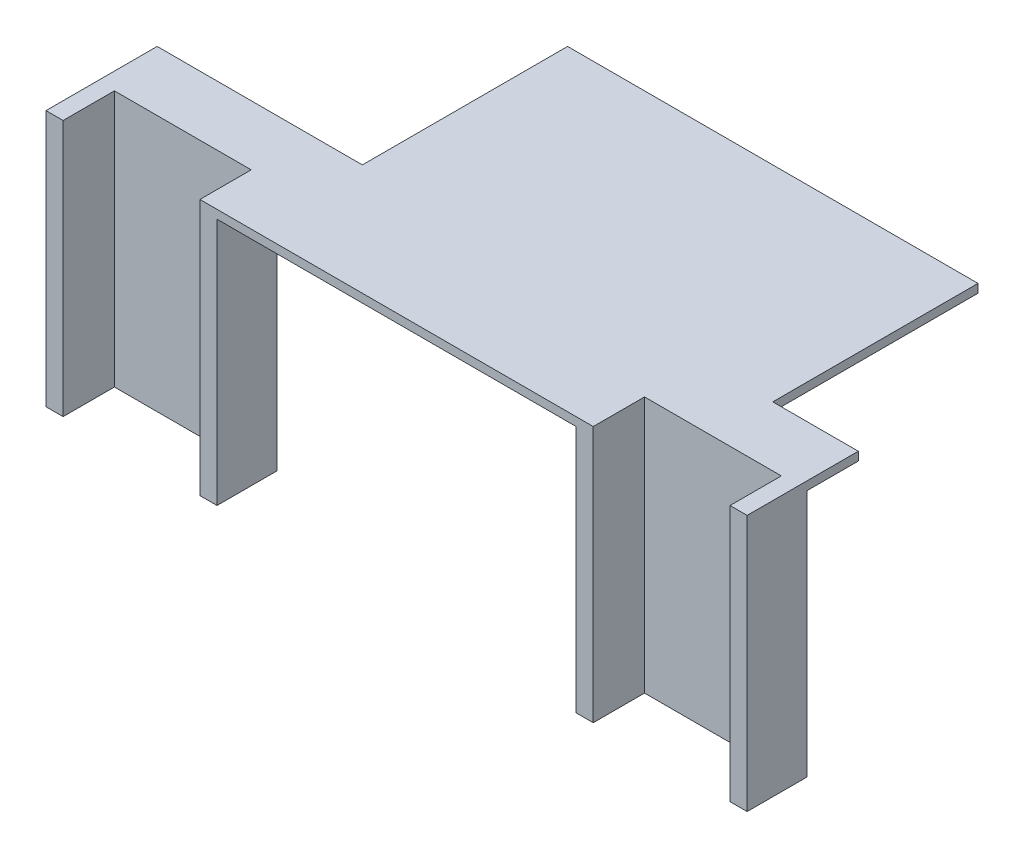
ISO-10303-21;
HEADER;
FILE_DESCRIPTION(('STEP AP214'),'2;1');
FILE_NAME('part.step','',(''),(''),'','','');
FILE_SCHEMA(('AUTOMOTIVE_DESIGN { 1 0 10303 214 1 1 1 1 }'));
ENDSEC;
DATA;
#1=APPLICATION_CONTEXT('core data for automotive mechanical design processes');
#2=APPLICATION_PROTOCOL_DEFINITION('international standard','automotive_design',2000,#1);
#3=PRODUCT_CONTEXT('',#1,'mechanical');
#4=PRODUCT('Part','Part','',(#3));
#5=PRODUCT_RELATED_PRODUCT_CATEGORY('part','',(#4));
#6=PRODUCT_DEFINITION_FORMATION('','',#4);
#7=PRODUCT_DEFINITION_CONTEXT('part definition',#1,'design');
#8=PRODUCT_DEFINITION('design','',#6,#7);
#9=PRODUCT_DEFINITION_SHAPE('','',#8);
#10=(LENGTH_UNIT() NAMED_UNIT(*) SI_UNIT(.MILLI.,.METRE.));
#11=(NAMED_UNIT(*) PLANE_ANGLE_UNIT() SI_UNIT($,.RADIAN.));
#12=(NAMED_UNIT(*) SI_UNIT($,.STERADIAN.) SOLID_ANGLE_UNIT());
#13=UNCERTAINTY_MEASURE_WITH_UNIT(LENGTH_MEASURE(1.E-05),#10,'distance_accuracy_value','');
#14=(GEOMETRIC_REPRESENTATION_CONTEXT(3) GLOBAL_UNCERTAINTY_ASSIGNED_CONTEXT((#13)) GLOBAL_UNIT_ASSIGNED_CONTEXT((#10,
#11,#12)) REPRESENTATION_CONTEXT('',''));
#15=CARTESIAN_POINT('',(0.,0.,0.));
#16=DIRECTION('',(0.,0.,1.));
#17=DIRECTION('',(1.,0.,0.));
#18=AXIS2_PLACEMENT_3D('',#15,#16,#17);
#19=CARTESIAN_POINT('',(0.,0.,35.));
#20=DIRECTION('',(0.,1.,0.));
#21=DIRECTION('',(0.,0.,1.));
#22=AXIS2_PLACEMENT_3D('',#19,#20,#21);
#23=PLANE('',#22);
#24=DIRECTION('',(1.,0.,0.));
#25=VECTOR('',#24,1.);
#26=CARTESIAN_POINT('',(0.,0.,0.));
#27=LINE('',#26,#25);
#28=CARTESIAN_POINT('',(0.,0.,0.));
#29=VERTEX_POINT('',#28);
#30=CARTESIAN_POINT('',(100.,0.,0.));
#31=VERTEX_POINT('',#30);
#32=EDGE_CURVE('E238',#29,#31,#27,.T.);
#33=ORIENTED_EDGE('',*,*,#32,.T.);
#34=DIRECTION('',(0.,0.,1.));
#35=VECTOR('',#34,1.);
#36=CARTESIAN_POINT('',(100.,0.,0.));
#37=LINE('',#36,#35);
#38=CARTESIAN_POINT('',(100.,0.,35.));
#39=VERTEX_POINT('',#38);
#40=EDGE_CURVE('E286',#31,#39,#37,.T.);
#41=ORIENTED_EDGE('',*,*,#40,.T.);
#42=DIRECTION('',(1.,0.,0.));
#43=VECTOR('',#42,1.);
#44=CARTESIAN_POINT('',(0.,0.,35.));
#45=LINE('',#44,#43);
#46=CARTESIAN_POINT('',(90.,0.,35.));
#47=VERTEX_POINT('',#46);
#48=EDGE_CURVE('E227',#47,#39,#45,.T.);
#49=ORIENTED_EDGE('',*,*,#48,.F.);
#50=DIRECTION('',(0.,0.,1.));
#51=VECTOR('',#50,1.);
#52=CARTESIAN_POINT('',(90.,0.,5.));
#53=LINE('',#52,#51);
#54=CARTESIAN_POINT('',(90.,0.,5.));
#55=VERTEX_POINT('',#54);
#56=EDGE_CURVE('E325',#55,#47,#53,.T.);
#57=ORIENTED_EDGE('',*,*,#56,.F.);
#58=DIRECTION('',(1.,0.,0.));
#59=VECTOR('',#58,1.);
#60=CARTESIAN_POINT('',(10.,0.,5.));
#61=LINE('',#60,#59);
#62=CARTESIAN_POINT('',(10.,0.,5.));
#63=VERTEX_POINT('',#62);
#64=EDGE_CURVE('E305',#63,#55,#61,.T.);
#65=ORIENTED_EDGE('',*,*,#64,.F.);
#66=DIRECTION('',(0.,0.,1.));
#67=VECTOR('',#66,1.);
#68=CARTESIAN_POINT('',(10.,0.,5.));
#69=LINE('',#68,#67);
#70=CARTESIAN_POINT('',(10.,0.,35.));
#71=VERTEX_POINT('',#70);
#72=EDGE_CURVE('E315',#63,#71,#69,.T.);
#73=ORIENTED_EDGE('',*,*,#72,.T.);
#74=CARTESIAN_POINT('',(0.,0.,35.));
#75=VERTEX_POINT('',#74);
#76=EDGE_CURVE('E223',#75,#71,#45,.T.);
#77=ORIENTED_EDGE('',*,*,#76,.F.);
#78=DIRECTION('',(0.,0.,-1.));
#79=VECTOR('',#78,1.);
#80=CARTESIAN_POINT('',(0.,0.,35.));
#81=LINE('',#80,#79);
#82=EDGE_CURVE('E250',#75,#29,#81,.T.);
#83=ORIENTED_EDGE('',*,*,#82,.T.);
#84=EDGE_LOOP('',(#33,#41,#49,#57,#65,#73,#77,#83));
#85=FACE_BOUND('',#84,.T.);
#86=ADVANCED_FACE('F38',(#85),#23,.F.);
#87=CARTESIAN_POINT('',(0.,0.,0.));
#88=DIRECTION('',(0.,0.,-1.));
#89=DIRECTION('',(-1.,0.,0.));
#90=AXIS2_PLACEMENT_3D('',#87,#88,#89);
#91=PLANE('',#90);
#92=DIRECTION('',(0.,-1.,0.));
#93=VECTOR('',#92,1.);
#94=CARTESIAN_POINT('',(100.,145.,0.));
#95=LINE('',#94,#93);
#96=CARTESIAN_POINT('',(100.,145.,0.));
#97=VERTEX_POINT('',#96);
#98=EDGE_CURVE('E279',#97,#31,#95,.T.);
#99=ORIENTED_EDGE('',*,*,#98,.T.);
#100=ORIENTED_EDGE('',*,*,#32,.F.);
#101=DIRECTION('',(0.,-1.,0.));
#102=VECTOR('',#101,1.);
#103=CARTESIAN_POINT('',(0.,0.,0.));
#104=LINE('',#103,#102);
#105=CARTESIAN_POINT('',(0.,145.,0.));
#106=VERTEX_POINT('',#105);
#107=EDGE_CURVE('E217',#106,#29,#104,.T.);
#108=ORIENTED_EDGE('',*,*,#107,.F.);
#109=DIRECTION('',(-1.,0.,0.));
#110=VECTOR('',#109,1.);
#111=CARTESIAN_POINT('',(410.,145.,0.));
#112=LINE('',#111,#110);
#113=EDGE_CURVE('E214',#97,#106,#112,.T.);
#114=ORIENTED_EDGE('',*,*,#113,.F.);
#115=EDGE_LOOP('',(#99,#100,#108,#114));
#116=FACE_BOUND('',#115,.T.);
#117=ADVANCED_FACE('F420',(#116),#91,.T.);
#118=CARTESIAN_POINT('',(0.,0.,35.));
#119=DIRECTION('',(0.,0.,-1.));
#120=DIRECTION('',(-1.,0.,0.));
#121=AXIS2_PLACEMENT_3D('',#118,#119,#120);
#122=PLANE('',#121);
#123=ORIENTED_EDGE('',*,*,#76,.T.);
#124=DIRECTION('',(0.,-1.,0.));
#125=VECTOR('',#124,1.);
#126=CARTESIAN_POINT('',(10.,0.,35.));
#127=LINE('',#126,#125);
#128=CARTESIAN_POINT('',(10.,150.,35.));
#129=VERTEX_POINT('',#128);
#130=EDGE_CURVE('E316',#129,#71,#127,.T.);
#131=ORIENTED_EDGE('',*,*,#130,.F.);
#132=DIRECTION('',(-1.,0.,0.));
#133=VECTOR('',#132,1.);
#134=CARTESIAN_POINT('',(0.,150.,35.));
#135=LINE('',#134,#133);
#136=CARTESIAN_POINT('',(0.,150.,35.));
#137=VERTEX_POINT('',#136);
#138=EDGE_CURVE('E230',#129,#137,#135,.T.);
#139=ORIENTED_EDGE('',*,*,#138,.T.);
#140=DIRECTION('',(0.,-1.,0.));
#141=VECTOR('',#140,1.);
#142=CARTESIAN_POINT('',(0.,0.,35.));
#143=LINE('',#142,#141);
#144=EDGE_CURVE('E218',#137,#75,#143,.T.);
#145=ORIENTED_EDGE('',*,*,#144,.T.);
#146=EDGE_LOOP('',(#123,#131,#139,#145));
#147=FACE_BOUND('',#146,.T.);
#148=ADVANCED_FACE('F379',(#147),#122,.F.);
#149=CARTESIAN_POINT('',(410.,150.,35.));
#150=VERTEX_POINT('',#149);
#151=CARTESIAN_POINT('',(400.,150.,35.));
#152=VERTEX_POINT('',#151);
#153=EDGE_CURVE('E231',#150,#152,#135,.T.);
#154=ORIENTED_EDGE('',*,*,#153,.T.);
#155=DIRECTION('',(0.,1.,0.));
#156=VECTOR('',#155,1.);
#157=CARTESIAN_POINT('',(400.,0.,35.));
#158=LINE('',#157,#156);
#159=CARTESIAN_POINT('',(400.,0.,35.));
#160=VERTEX_POINT('',#159);
#161=EDGE_CURVE('E295',#160,#152,#158,.T.);
#162=ORIENTED_EDGE('',*,*,#161,.F.);
#163=CARTESIAN_POINT('',(410.,0.,35.));
#164=VERTEX_POINT('',#163);
#165=EDGE_CURVE('E221',#160,#164,#45,.T.);
#166=ORIENTED_EDGE('',*,*,#165,.T.);
#167=DIRECTION('',(0.,1.,0.));
#168=VECTOR('',#167,1.);
#169=CARTESIAN_POINT('',(410.,0.,35.));
#170=LINE('',#169,#168);
#171=EDGE_CURVE('E226',#164,#150,#170,.T.);
#172=ORIENTED_EDGE('',*,*,#171,.T.);
#173=EDGE_LOOP('',(#154,#162,#166,#172));
#174=FACE_BOUND('',#173,.T.);
#175=ADVANCED_FACE('F358',(#174),#122,.F.);
#176=CARTESIAN_POINT('',(0.,0.,35.));
#177=DIRECTION('',(1.,0.,0.));
#178=DIRECTION('',(0.,0.,-1.));
#179=AXIS2_PLACEMENT_3D('',#176,#177,#178);
#180=PLANE('',#179);
#181=DIRECTION('',(0.,0.,-1.));
#182=VECTOR('',#181,1.);
#183=CARTESIAN_POINT('',(0.,150.,35.));
#184=LINE('',#183,#182);
#185=CARTESIAN_POINT('',(0.,150.,-30.));
#186=VERTEX_POINT('',#185);
#187=EDGE_CURVE('E234',#137,#186,#184,.T.);
#188=ORIENTED_EDGE('',*,*,#187,.T.);
#189=DIRECTION('',(0.,1.,0.));
#190=VECTOR('',#189,1.);
#191=CARTESIAN_POINT('',(0.,140.,-30.));
#192=LINE('',#191,#190);
#193=CARTESIAN_POINT('',(0.,145.,-30.));
#194=VERTEX_POINT('',#193);
#195=EDGE_CURVE('E266',#194,#186,#192,.T.);
#196=ORIENTED_EDGE('',*,*,#195,.F.);
#197=DIRECTION('',(0.,0.,1.));
#198=VECTOR('',#197,1.);
#199=CARTESIAN_POINT('',(0.,145.,-150.));
#200=LINE('',#199,#198);
#201=EDGE_CURVE('E204',#194,#106,#200,.T.);
#202=ORIENTED_EDGE('',*,*,#201,.T.);
#203=ORIENTED_EDGE('',*,*,#107,.T.);
#204=ORIENTED_EDGE('',*,*,#82,.F.);
#205=ORIENTED_EDGE('',*,*,#144,.F.);
#206=EDGE_LOOP('',(#188,#196,#202,#203,#204,#205));
#207=FACE_BOUND('',#206,.T.);
#208=ADVANCED_FACE('F40',(#207),#180,.F.);
#209=CARTESIAN_POINT('',(310.,0.,35.));
#210=VERTEX_POINT('',#209);
#211=CARTESIAN_POINT('',(320.,0.,35.));
#212=VERTEX_POINT('',#211);
#213=EDGE_CURVE('E228',#210,#212,#45,.T.);
#214=ORIENTED_EDGE('',*,*,#213,.F.);
#215=DIRECTION('',(0.,0.,1.));
#216=VECTOR('',#215,1.);
#217=CARTESIAN_POINT('',(310.,0.,0.));
#218=LINE('',#217,#216);
#219=CARTESIAN_POINT('',(310.,0.,0.));
#220=VERTEX_POINT('',#219);
#221=EDGE_CURVE('E298',#220,#210,#218,.T.);
#222=ORIENTED_EDGE('',*,*,#221,.F.);
#223=CARTESIAN_POINT('',(410.,0.,0.));
#224=VERTEX_POINT('',#223);
#225=EDGE_CURVE('E237',#220,#224,#27,.T.);
#226=ORIENTED_EDGE('',*,*,#225,.T.);
#227=DIRECTION('',(0.,0.,-1.));
#228=VECTOR('',#227,1.);
#229=CARTESIAN_POINT('',(410.,0.,35.));
#230=LINE('',#229,#228);
#231=EDGE_CURVE('E247',#164,#224,#230,.T.);
#232=ORIENTED_EDGE('',*,*,#231,.F.);
#233=ORIENTED_EDGE('',*,*,#165,.F.);
#234=DIRECTION('',(0.,0.,1.));
#235=VECTOR('',#234,1.);
#236=CARTESIAN_POINT('',(400.,0.,5.));
#237=LINE('',#236,#235);
#238=CARTESIAN_POINT('',(400.,0.,5.));
#239=VERTEX_POINT('',#238);
#240=EDGE_CURVE('E318',#239,#160,#237,.T.);
#241=ORIENTED_EDGE('',*,*,#240,.F.);
#242=DIRECTION('',(1.,0.,0.));
#243=VECTOR('',#242,1.);
#244=CARTESIAN_POINT('',(400.,0.,5.));
#245=LINE('',#244,#243);
#246=CARTESIAN_POINT('',(320.,0.,5.));
#247=VERTEX_POINT('',#246);
#248=EDGE_CURVE('E339',#247,#239,#245,.T.);
#249=ORIENTED_EDGE('',*,*,#248,.F.);
#250=DIRECTION('',(0.,0.,1.));
#251=VECTOR('',#250,1.);
#252=CARTESIAN_POINT('',(320.,0.,5.));
#253=LINE('',#252,#251);
#254=EDGE_CURVE('E347',#247,#212,#253,.T.);
#255=ORIENTED_EDGE('',*,*,#254,.T.);
#256=EDGE_LOOP('',(#214,#222,#226,#232,#233,#241,#249,#255));
#257=FACE_BOUND('',#256,.T.);
#258=ADVANCED_FACE('F406',(#257),#23,.F.);
#259=CARTESIAN_POINT('',(410.,0.,35.));
#260=DIRECTION('',(-1.,0.,0.));
#261=DIRECTION('',(0.,0.,1.));
#262=AXIS2_PLACEMENT_3D('',#259,#260,#261);
#263=PLANE('',#262);
#264=DIRECTION('',(0.,0.,1.));
#265=VECTOR('',#264,1.);
#266=CARTESIAN_POINT('',(410.,145.,-150.));
#267=LINE('',#266,#265);
#268=CARTESIAN_POINT('',(410.,145.,-30.));
#269=VERTEX_POINT('',#268);
#270=CARTESIAN_POINT('',(410.,145.,0.));
#271=VERTEX_POINT('',#270);
#272=EDGE_CURVE('E207',#269,#271,#267,.T.);
#273=ORIENTED_EDGE('',*,*,#272,.F.);
#274=DIRECTION('',(0.,1.,0.));
#275=VECTOR('',#274,1.);
#276=CARTESIAN_POINT('',(410.,140.,-30.));
#277=LINE('',#276,#275);
#278=CARTESIAN_POINT('',(410.,150.,-30.));
#279=VERTEX_POINT('',#278);
#280=EDGE_CURVE('E367',#269,#279,#277,.T.);
#281=ORIENTED_EDGE('',*,*,#280,.T.);
#282=DIRECTION('',(0.,0.,-1.));
#283=VECTOR('',#282,1.);
#284=CARTESIAN_POINT('',(410.,150.,35.));
#285=LINE('',#284,#283);
#286=EDGE_CURVE('E245',#150,#279,#285,.T.);
#287=ORIENTED_EDGE('',*,*,#286,.F.);
#288=ORIENTED_EDGE('',*,*,#171,.F.);
#289=ORIENTED_EDGE('',*,*,#231,.T.);
#290=DIRECTION('',(0.,1.,0.));
#291=VECTOR('',#290,1.);
#292=CARTESIAN_POINT('',(410.,0.,0.));
#293=LINE('',#292,#291);
#294=EDGE_CURVE('E222',#224,#271,#293,.T.);
#295=ORIENTED_EDGE('',*,*,#294,.T.);
#296=EDGE_LOOP('',(#273,#281,#287,#288,#289,#295));
#297=FACE_BOUND('',#296,.T.);
#298=ADVANCED_FACE('F366',(#297),#263,.F.);
#299=CARTESIAN_POINT('',(0.,150.,35.));
#300=DIRECTION('',(0.,-1.,0.));
#301=DIRECTION('',(0.,0.,-1.));
#302=AXIS2_PLACEMENT_3D('',#299,#300,#301);
#303=PLANE('',#302);
#304=ORIENTED_EDGE('',*,*,#286,.T.);
#305=DIRECTION('',(1.,0.,0.));
#306=VECTOR('',#305,1.);
#307=CARTESIAN_POINT('',(410.,150.,-30.));
#308=LINE('',#307,#306);
#309=CARTESIAN_POINT('',(360.,150.,-30.));
#310=VERTEX_POINT('',#309);
#311=EDGE_CURVE('E200',#310,#279,#308,.T.);
#312=ORIENTED_EDGE('',*,*,#311,.F.);
#313=DIRECTION('',(0.,0.,1.));
#314=VECTOR('',#313,1.);
#315=CARTESIAN_POINT('',(360.,150.,-150.));
#316=LINE('',#315,#314);
#317=CARTESIAN_POINT('',(360.,150.,-150.));
#318=VERTEX_POINT('',#317);
#319=EDGE_CURVE('E189',#318,#310,#316,.T.);
#320=ORIENTED_EDGE('',*,*,#319,.F.);
#321=DIRECTION('',(1.,0.,0.));
#322=VECTOR('',#321,1.);
#323=CARTESIAN_POINT('',(410.,150.,-150.));
#324=LINE('',#323,#322);
#325=CARTESIAN_POINT('',(120.,150.,-150.));
#326=VERTEX_POINT('',#325);
#327=EDGE_CURVE('E199',#326,#318,#324,.T.);
#328=ORIENTED_EDGE('',*,*,#327,.F.);
#329=DIRECTION('',(0.,0.,-1.));
#330=VECTOR('',#329,1.);
#331=CARTESIAN_POINT('',(120.,150.,-150.));
#332=LINE('',#331,#330);
#333=CARTESIAN_POINT('',(120.,150.,-30.));
#334=VERTEX_POINT('',#333);
#335=EDGE_CURVE('E61',#334,#326,#332,.T.);
#336=ORIENTED_EDGE('',*,*,#335,.F.);
#337=DIRECTION('',(1.,0.,0.));
#338=VECTOR('',#337,1.);
#339=CARTESIAN_POINT('',(0.,150.,-30.));
#340=LINE('',#339,#338);
#341=EDGE_CURVE('E274',#186,#334,#340,.T.);
#342=ORIENTED_EDGE('',*,*,#341,.F.);
#343=ORIENTED_EDGE('',*,*,#187,.F.);
#344=ORIENTED_EDGE('',*,*,#138,.F.);
#345=DIRECTION('',(0.,0.,1.));
#346=VECTOR('',#345,1.);
#347=CARTESIAN_POINT('',(10.,150.,5.));
#348=LINE('',#347,#346);
#349=CARTESIAN_POINT('',(10.,150.,5.));
#350=VERTEX_POINT('',#349);
#351=EDGE_CURVE('E320',#350,#129,#348,.T.);
#352=ORIENTED_EDGE('',*,*,#351,.F.);
#353=DIRECTION('',(-1.,0.,0.));
#354=VECTOR('',#353,1.);
#355=CARTESIAN_POINT('',(10.,150.,5.));
#356=LINE('',#355,#354);
#357=CARTESIAN_POINT('',(90.,150.,5.));
#358=VERTEX_POINT('',#357);
#359=EDGE_CURVE('E312',#358,#350,#356,.T.);
#360=ORIENTED_EDGE('',*,*,#359,.F.);
#361=DIRECTION('',(0.,0.,1.));
#362=VECTOR('',#361,1.);
#363=CARTESIAN_POINT('',(90.,150.,5.));
#364=LINE('',#363,#362);
#365=CARTESIAN_POINT('',(90.,150.,35.));
#366=VERTEX_POINT('',#365);
#367=EDGE_CURVE('E322',#358,#366,#364,.T.);
#368=ORIENTED_EDGE('',*,*,#367,.T.);
#369=CARTESIAN_POINT('',(320.,150.,35.));
#370=VERTEX_POINT('',#369);
#371=EDGE_CURVE('E235',#370,#366,#135,.T.);
#372=ORIENTED_EDGE('',*,*,#371,.F.);
#373=DIRECTION('',(0.,0.,1.));
#374=VECTOR('',#373,1.);
#375=CARTESIAN_POINT('',(320.,150.,5.));
#376=LINE('',#375,#374);
#377=CARTESIAN_POINT('',(320.,150.,5.));
#378=VERTEX_POINT('',#377);
#379=EDGE_CURVE('E350',#378,#370,#376,.T.);
#380=ORIENTED_EDGE('',*,*,#379,.F.);
#381=DIRECTION('',(-1.,0.,0.));
#382=VECTOR('',#381,1.);
#383=CARTESIAN_POINT('',(400.,150.,5.));
#384=LINE('',#383,#382);
#385=CARTESIAN_POINT('',(400.,150.,5.));
#386=VERTEX_POINT('',#385);
#387=EDGE_CURVE('E332',#386,#378,#384,.T.);
#388=ORIENTED_EDGE('',*,*,#387,.F.);
#389=DIRECTION('',(0.,0.,1.));
#390=VECTOR('',#389,1.);
#391=CARTESIAN_POINT('',(400.,150.,5.));
#392=LINE('',#391,#390);
#393=EDGE_CURVE('E342',#386,#152,#392,.T.);
#394=ORIENTED_EDGE('',*,*,#393,.T.);
#395=ORIENTED_EDGE('',*,*,#153,.F.);
#396=EDGE_LOOP('',(#304,#312,#320,#328,#336,#342,#343,#344,#352,#360,#368,#372,#380,#388,#394,#395));
#397=FACE_BOUND('',#396,.T.);
#398=ADVANCED_FACE('F198',(#397),#303,.F.);
#399=ORIENTED_EDGE('',*,*,#48,.T.);
#400=DIRECTION('',(0.,-1.,0.));
#401=VECTOR('',#400,1.);
#402=CARTESIAN_POINT('',(100.,145.,35.));
#403=LINE('',#402,#401);
#404=CARTESIAN_POINT('',(100.,145.,35.));
#405=VERTEX_POINT('',#404);
#406=EDGE_CURVE('E278',#405,#39,#403,.T.);
#407=ORIENTED_EDGE('',*,*,#406,.F.);
#408=DIRECTION('',(-1.,0.,0.));
#409=VECTOR('',#408,1.);
#410=CARTESIAN_POINT('',(100.,145.,35.));
#411=LINE('',#410,#409);
#412=CARTESIAN_POINT('',(310.,145.,35.));
#413=VERTEX_POINT('',#412);
#414=EDGE_CURVE('E283',#413,#405,#411,.T.);
#415=ORIENTED_EDGE('',*,*,#414,.F.);
#416=DIRECTION('',(0.,1.,0.));
#417=VECTOR('',#416,1.);
#418=CARTESIAN_POINT('',(310.,145.,35.));
#419=LINE('',#418,#417);
#420=EDGE_CURVE('E288',#210,#413,#419,.T.);
#421=ORIENTED_EDGE('',*,*,#420,.F.);
#422=ORIENTED_EDGE('',*,*,#213,.T.);
#423=DIRECTION('',(0.,-1.,0.));
#424=VECTOR('',#423,1.);
#425=CARTESIAN_POINT('',(320.,0.,35.));
#426=LINE('',#425,#424);
#427=EDGE_CURVE('E333',#370,#212,#426,.T.);
#428=ORIENTED_EDGE('',*,*,#427,.F.);
#429=ORIENTED_EDGE('',*,*,#371,.T.);
#430=DIRECTION('',(0.,1.,0.));
#431=VECTOR('',#430,1.);
#432=CARTESIAN_POINT('',(90.,0.,35.));
#433=LINE('',#432,#431);
#434=EDGE_CURVE('E306',#47,#366,#433,.T.);
#435=ORIENTED_EDGE('',*,*,#434,.F.);
#436=EDGE_LOOP('',(#399,#407,#415,#421,#422,#428,#429,#435));
#437=FACE_BOUND('',#436,.T.);
#438=ADVANCED_FACE('F387',(#437),#122,.F.);
#439=DIRECTION('',(0.,1.,0.));
#440=VECTOR('',#439,1.);
#441=CARTESIAN_POINT('',(310.,145.,0.));
#442=LINE('',#441,#440);
#443=CARTESIAN_POINT('',(310.,145.,0.));
#444=VERTEX_POINT('',#443);
#445=EDGE_CURVE('E282',#220,#444,#442,.T.);
#446=ORIENTED_EDGE('',*,*,#445,.T.);
#447=EDGE_CURVE('E209',#271,#444,#112,.T.);
#448=ORIENTED_EDGE('',*,*,#447,.F.);
#449=ORIENTED_EDGE('',*,*,#294,.F.);
#450=ORIENTED_EDGE('',*,*,#225,.F.);
#451=EDGE_LOOP('',(#446,#448,#449,#450));
#452=FACE_BOUND('',#451,.T.);
#453=ADVANCED_FACE('F426',(#452),#91,.T.);
#454=CARTESIAN_POINT('',(410.,145.,-150.));
#455=DIRECTION('',(0.,1.,0.));
#456=DIRECTION('',(0.,0.,1.));
#457=AXIS2_PLACEMENT_3D('',#454,#455,#456);
#458=PLANE('',#457);
#459=DIRECTION('',(0.,0.,1.));
#460=VECTOR('',#459,1.);
#461=CARTESIAN_POINT('',(360.,145.,-150.));
#462=LINE('',#461,#460);
#463=CARTESIAN_POINT('',(360.,145.,-150.));
#464=VERTEX_POINT('',#463);
#465=CARTESIAN_POINT('',(360.,145.,-30.));
#466=VERTEX_POINT('',#465);
#467=EDGE_CURVE('E53',#464,#466,#462,.T.);
#468=ORIENTED_EDGE('',*,*,#467,.T.);
#469=DIRECTION('',(1.,0.,0.));
#470=VECTOR('',#469,1.);
#471=CARTESIAN_POINT('',(410.,145.,-30.));
#472=LINE('',#471,#470);
#473=EDGE_CURVE('E11',#466,#269,#472,.T.);
#474=ORIENTED_EDGE('',*,*,#473,.T.);
#475=ORIENTED_EDGE('',*,*,#272,.T.);
#476=ORIENTED_EDGE('',*,*,#447,.T.);
#477=DIRECTION('',(0.,0.,1.));
#478=VECTOR('',#477,1.);
#479=CARTESIAN_POINT('',(310.,145.,0.));
#480=LINE('',#479,#478);
#481=EDGE_CURVE('E296',#444,#413,#480,.T.);
#482=ORIENTED_EDGE('',*,*,#481,.T.);
#483=ORIENTED_EDGE('',*,*,#414,.T.);
#484=DIRECTION('',(0.,0.,1.));
#485=VECTOR('',#484,1.);
#486=CARTESIAN_POINT('',(100.,145.,0.));
#487=LINE('',#486,#485);
#488=EDGE_CURVE('E293',#97,#405,#487,.T.);
#489=ORIENTED_EDGE('',*,*,#488,.F.);
#490=ORIENTED_EDGE('',*,*,#113,.T.);
#491=ORIENTED_EDGE('',*,*,#201,.F.);
#492=DIRECTION('',(1.,0.,0.));
#493=VECTOR('',#492,1.);
#494=CARTESIAN_POINT('',(410.,145.,-30.));
#495=LINE('',#494,#493);
#496=CARTESIAN_POINT('',(120.,145.,-30.));
#497=VERTEX_POINT('',#496);
#498=EDGE_CURVE('E194',#194,#497,#495,.T.);
#499=ORIENTED_EDGE('',*,*,#498,.T.);
#500=DIRECTION('',(0.,0.,-1.));
#501=VECTOR('',#500,1.);
#502=CARTESIAN_POINT('',(120.,145.,-150.));
#503=LINE('',#502,#501);
#504=CARTESIAN_POINT('',(120.,145.,-150.));
#505=VERTEX_POINT('',#504);
#506=EDGE_CURVE('E259',#497,#505,#503,.T.);
#507=ORIENTED_EDGE('',*,*,#506,.T.);
#508=DIRECTION('',(-1.,0.,0.));
#509=VECTOR('',#508,1.);
#510=CARTESIAN_POINT('',(410.,145.,-150.));
#511=LINE('',#510,#509);
#512=EDGE_CURVE('E205',#464,#505,#511,.T.);
#513=ORIENTED_EDGE('',*,*,#512,.F.);
#514=EDGE_LOOP('',(#468,#474,#475,#476,#482,#483,#489,#490,#491,#499,#507,#513));
#515=FACE_BOUND('',#514,.T.);
#516=ADVANCED_FACE('F258',(#515),#458,.F.);
#517=CARTESIAN_POINT('',(0.,0.,-150.));
#518=DIRECTION('',(0.,0.,-1.));
#519=DIRECTION('',(-1.,0.,0.));
#520=AXIS2_PLACEMENT_3D('',#517,#518,#519);
#521=PLANE('',#520);
#522=DIRECTION('',(0.,1.,0.));
#523=VECTOR('',#522,1.);
#524=CARTESIAN_POINT('',(360.,0.,-150.));
#525=LINE('',#524,#523);
#526=EDGE_CURVE('E46',#464,#318,#525,.T.);
#527=ORIENTED_EDGE('',*,*,#526,.F.);
#528=ORIENTED_EDGE('',*,*,#512,.T.);
#529=DIRECTION('',(0.,-1.,0.));
#530=VECTOR('',#529,1.);
#531=CARTESIAN_POINT('',(120.,0.,-150.));
#532=LINE('',#531,#530);
#533=EDGE_CURVE('E203',#326,#505,#532,.T.);
#534=ORIENTED_EDGE('',*,*,#533,.F.);
#535=ORIENTED_EDGE('',*,*,#327,.T.);
#536=EDGE_LOOP('',(#527,#528,#534,#535));
#537=FACE_BOUND('',#536,.T.);
#538=ADVANCED_FACE('F202',(#537),#521,.T.);
#539=CARTESIAN_POINT('',(400.,0.,5.));
#540=DIRECTION('',(1.,0.,0.));
#541=DIRECTION('',(0.,0.,-1.));
#542=AXIS2_PLACEMENT_3D('',#539,#540,#541);
#543=PLANE('',#542);
#544=ORIENTED_EDGE('',*,*,#161,.T.);
#545=ORIENTED_EDGE('',*,*,#393,.F.);
#546=DIRECTION('',(0.,1.,0.));
#547=VECTOR('',#546,1.);
#548=CARTESIAN_POINT('',(400.,0.,5.));
#549=LINE('',#548,#547);
#550=EDGE_CURVE('E329',#239,#386,#549,.T.);
#551=ORIENTED_EDGE('',*,*,#550,.F.);
#552=ORIENTED_EDGE('',*,*,#240,.T.);
#553=EDGE_LOOP('',(#544,#545,#551,#552));
#554=FACE_BOUND('',#553,.T.);
#555=ADVANCED_FACE('F410',(#554),#543,.F.);
#556=CARTESIAN_POINT('',(320.,0.,5.));
#557=DIRECTION('',(-1.,0.,0.));
#558=DIRECTION('',(0.,0.,1.));
#559=AXIS2_PLACEMENT_3D('',#556,#557,#558);
#560=PLANE('',#559);
#561=ORIENTED_EDGE('',*,*,#427,.T.);
#562=ORIENTED_EDGE('',*,*,#254,.F.);
#563=DIRECTION('',(0.,-1.,0.));
#564=VECTOR('',#563,1.);
#565=CARTESIAN_POINT('',(320.,0.,5.));
#566=LINE('',#565,#564);
#567=EDGE_CURVE('E336',#378,#247,#566,.T.);
#568=ORIENTED_EDGE('',*,*,#567,.F.);
#569=ORIENTED_EDGE('',*,*,#379,.T.);
#570=EDGE_LOOP('',(#561,#562,#568,#569));
#571=FACE_BOUND('',#570,.T.);
#572=ADVANCED_FACE('F404',(#571),#560,.F.);
#573=CARTESIAN_POINT('',(0.,0.,5.));
#574=DIRECTION('',(0.,0.,1.));
#575=DIRECTION('',(1.,0.,0.));
#576=AXIS2_PLACEMENT_3D('',#573,#574,#575);
#577=PLANE('',#576);
#578=ORIENTED_EDGE('',*,*,#550,.T.);
#579=ORIENTED_EDGE('',*,*,#387,.T.);
#580=ORIENTED_EDGE('',*,*,#567,.T.);
#581=ORIENTED_EDGE('',*,*,#248,.T.);
#582=EDGE_LOOP('',(#578,#579,#580,#581));
#583=FACE_BOUND('',#582,.T.);
#584=ADVANCED_FACE('F409',(#583),#577,.T.);
#585=CARTESIAN_POINT('',(10.,0.,5.));
#586=DIRECTION('',(-1.,0.,0.));
#587=DIRECTION('',(0.,0.,1.));
#588=AXIS2_PLACEMENT_3D('',#585,#586,#587);
#589=PLANE('',#588);
#590=ORIENTED_EDGE('',*,*,#130,.T.);
#591=ORIENTED_EDGE('',*,*,#72,.F.);
#592=DIRECTION('',(0.,-1.,0.));
#593=VECTOR('',#592,1.);
#594=CARTESIAN_POINT('',(10.,0.,5.));
#595=LINE('',#594,#593);
#596=EDGE_CURVE('E302',#350,#63,#595,.T.);
#597=ORIENTED_EDGE('',*,*,#596,.F.);
#598=ORIENTED_EDGE('',*,*,#351,.T.);
#599=EDGE_LOOP('',(#590,#591,#597,#598));
#600=FACE_BOUND('',#599,.T.);
#601=ADVANCED_FACE('F545',(#600),#589,.F.);
#602=CARTESIAN_POINT('',(90.,0.,5.));
#603=DIRECTION('',(1.,0.,0.));
#604=DIRECTION('',(0.,0.,-1.));
#605=AXIS2_PLACEMENT_3D('',#602,#603,#604);
#606=PLANE('',#605);
#607=ORIENTED_EDGE('',*,*,#434,.T.);
#608=ORIENTED_EDGE('',*,*,#367,.F.);
#609=DIRECTION('',(0.,1.,0.));
#610=VECTOR('',#609,1.);
#611=CARTESIAN_POINT('',(90.,0.,5.));
#612=LINE('',#611,#610);
#613=EDGE_CURVE('E309',#55,#358,#612,.T.);
#614=ORIENTED_EDGE('',*,*,#613,.F.);
#615=ORIENTED_EDGE('',*,*,#56,.T.);
#616=EDGE_LOOP('',(#607,#608,#614,#615));
#617=FACE_BOUND('',#616,.T.);
#618=ADVANCED_FACE('F391',(#617),#606,.F.);
#619=CARTESIAN_POINT('',(0.,0.,5.));
#620=DIRECTION('',(0.,0.,-1.));
#621=DIRECTION('',(-1.,0.,0.));
#622=AXIS2_PLACEMENT_3D('',#619,#620,#621);
#623=PLANE('',#622);
#624=ORIENTED_EDGE('',*,*,#596,.T.);
#625=ORIENTED_EDGE('',*,*,#64,.T.);
#626=ORIENTED_EDGE('',*,*,#613,.T.);
#627=ORIENTED_EDGE('',*,*,#359,.T.);
#628=EDGE_LOOP('',(#624,#625,#626,#627));
#629=FACE_BOUND('',#628,.T.);
#630=ADVANCED_FACE('F393',(#629),#623,.F.);
#631=CARTESIAN_POINT('',(100.,145.,0.));
#632=DIRECTION('',(-1.,0.,0.));
#633=DIRECTION('',(0.,-1.,0.));
#634=AXIS2_PLACEMENT_3D('',#631,#632,#633);
#635=PLANE('',#634);
#636=ORIENTED_EDGE('',*,*,#406,.T.);
#637=ORIENTED_EDGE('',*,*,#40,.F.);
#638=ORIENTED_EDGE('',*,*,#98,.F.);
#639=ORIENTED_EDGE('',*,*,#488,.T.);
#640=EDGE_LOOP('',(#636,#637,#638,#639));
#641=FACE_BOUND('',#640,.T.);
#642=ADVANCED_FACE('F492',(#641),#635,.F.);
#643=CARTESIAN_POINT('',(310.,145.,0.));
#644=DIRECTION('',(1.,0.,0.));
#645=DIRECTION('',(0.,0.,-1.));
#646=AXIS2_PLACEMENT_3D('',#643,#644,#645);
#647=PLANE('',#646);
#648=ORIENTED_EDGE('',*,*,#420,.T.);
#649=ORIENTED_EDGE('',*,*,#481,.F.);
#650=ORIENTED_EDGE('',*,*,#445,.F.);
#651=ORIENTED_EDGE('',*,*,#221,.T.);
#652=EDGE_LOOP('',(#648,#649,#650,#651));
#653=FACE_BOUND('',#652,.T.);
#654=ADVANCED_FACE('F477',(#653),#647,.F.);
#655=CARTESIAN_POINT('',(0.,140.,-30.));
#656=DIRECTION('',(0.,0.,1.));
#657=DIRECTION('',(1.,0.,0.));
#658=AXIS2_PLACEMENT_3D('',#655,#656,#657);
#659=PLANE('',#658);
#660=ORIENTED_EDGE('',*,*,#195,.T.);
#661=ORIENTED_EDGE('',*,*,#341,.T.);
#662=DIRECTION('',(0.,1.,0.));
#663=VECTOR('',#662,1.);
#664=CARTESIAN_POINT('',(120.,140.,-30.));
#665=LINE('',#664,#663);
#666=EDGE_CURVE('E268',#497,#334,#665,.T.);
#667=ORIENTED_EDGE('',*,*,#666,.F.);
#668=ORIENTED_EDGE('',*,*,#498,.F.);
#669=EDGE_LOOP('',(#660,#661,#667,#668));
#670=FACE_BOUND('',#669,.T.);
#671=ADVANCED_FACE('F264',(#670),#659,.F.);
#672=CARTESIAN_POINT('',(120.,140.,-150.));
#673=DIRECTION('',(1.,0.,0.));
#674=DIRECTION('',(0.,0.,-1.));
#675=AXIS2_PLACEMENT_3D('',#672,#673,#674);
#676=PLANE('',#675);
#677=ORIENTED_EDGE('',*,*,#666,.T.);
#678=ORIENTED_EDGE('',*,*,#335,.T.);
#679=ORIENTED_EDGE('',*,*,#533,.T.);
#680=ORIENTED_EDGE('',*,*,#506,.F.);
#681=EDGE_LOOP('',(#677,#678,#679,#680));
#682=FACE_BOUND('',#681,.T.);
#683=ADVANCED_FACE('F462',(#682),#676,.F.);
#684=CARTESIAN_POINT('',(410.,140.,-30.));
#685=DIRECTION('',(0.,0.,1.));
#686=DIRECTION('',(1.,0.,0.));
#687=AXIS2_PLACEMENT_3D('',#684,#685,#686);
#688=PLANE('',#687);
#689=DIRECTION('',(0.,1.,0.));
#690=VECTOR('',#689,1.);
#691=CARTESIAN_POINT('',(360.,140.,-30.));
#692=LINE('',#691,#690);
#693=EDGE_CURVE('E369',#466,#310,#692,.T.);
#694=ORIENTED_EDGE('',*,*,#693,.T.);
#695=ORIENTED_EDGE('',*,*,#311,.T.);
#696=ORIENTED_EDGE('',*,*,#280,.F.);
#697=ORIENTED_EDGE('',*,*,#473,.F.);
#698=EDGE_LOOP('',(#694,#695,#696,#697));
#699=FACE_BOUND('',#698,.T.);
#700=ADVANCED_FACE('F467',(#699),#688,.F.);
#701=CARTESIAN_POINT('',(360.,140.,-150.));
#702=DIRECTION('',(-1.,0.,0.));
#703=DIRECTION('',(0.,0.,1.));
#704=AXIS2_PLACEMENT_3D('',#701,#702,#703);
#705=PLANE('',#704);
#706=ORIENTED_EDGE('',*,*,#526,.T.);
#707=ORIENTED_EDGE('',*,*,#319,.T.);
#708=ORIENTED_EDGE('',*,*,#693,.F.);
#709=ORIENTED_EDGE('',*,*,#467,.F.);
#710=EDGE_LOOP('',(#706,#707,#708,#709));
#711=FACE_BOUND('',#710,.T.);
#712=ADVANCED_FACE('F188',(#711),#705,.F.);
#713=CLOSED_SHELL('',(#86,#117,#148,#175,#208,#258,#298,#398,#438,#453,#516,#538,#555,#572,#584,
#601,#618,#630,#642,#654,#671,#683,#700,#712));
#714=MANIFOLD_SOLID_BREP('B2',#713);
#715=ADVANCED_BREP_SHAPE_REPRESENTATION('',(#18,#714),#14);
#716=SHAPE_DEFINITION_REPRESENTATION(#9,#715);
ENDSEC;
END-ISO-10303-21;
